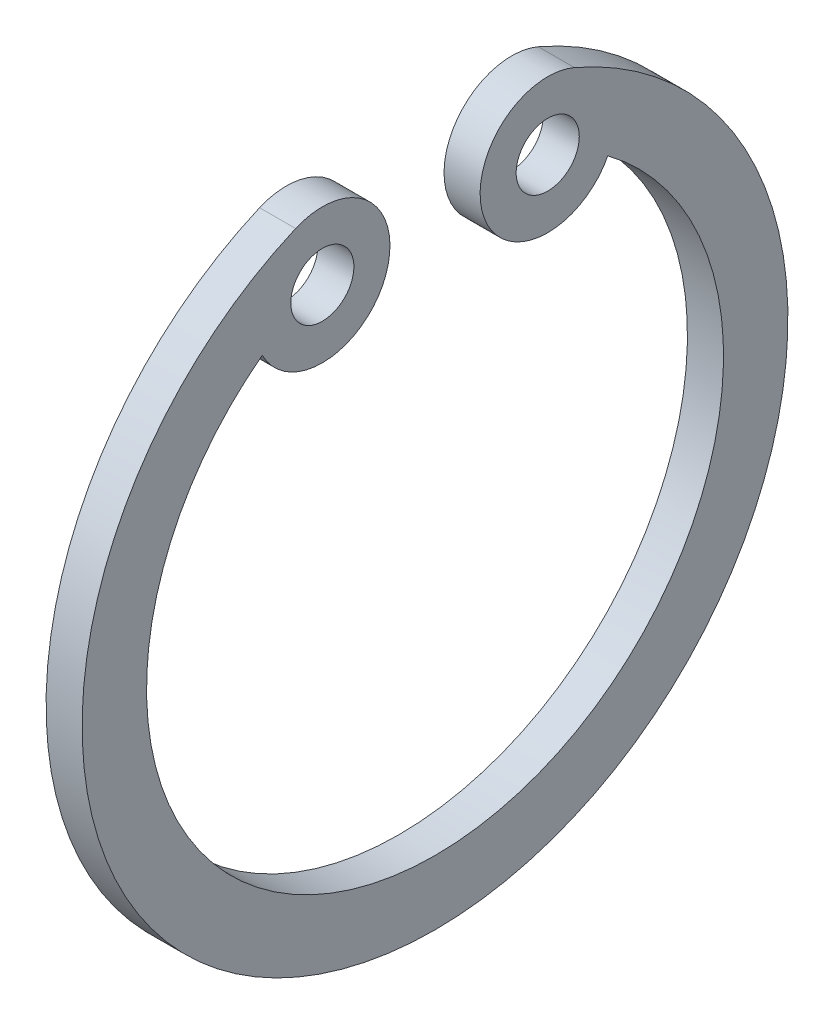
ISO-10303-21;
HEADER;
FILE_DESCRIPTION(('STEP AP214'),'2;1');
FILE_NAME('part.step','',(''),(''),'','','');
FILE_SCHEMA(('AUTOMOTIVE_DESIGN { 1 0 10303 214 1 1 1 1 }'));
ENDSEC;
DATA;
#1=APPLICATION_CONTEXT('core data for automotive mechanical design processes');
#2=APPLICATION_PROTOCOL_DEFINITION('international standard','automotive_design',2000,#1);
#3=PRODUCT_CONTEXT('',#1,'mechanical');
#4=PRODUCT('Part','Part','',(#3));
#5=PRODUCT_RELATED_PRODUCT_CATEGORY('part','',(#4));
#6=PRODUCT_DEFINITION_FORMATION('','',#4);
#7=PRODUCT_DEFINITION_CONTEXT('part definition',#1,'design');
#8=PRODUCT_DEFINITION('design','',#6,#7);
#9=PRODUCT_DEFINITION_SHAPE('','',#8);
#10=(LENGTH_UNIT() NAMED_UNIT(*) SI_UNIT(.MILLI.,.METRE.));
#11=(NAMED_UNIT(*) PLANE_ANGLE_UNIT() SI_UNIT($,.RADIAN.));
#12=(NAMED_UNIT(*) SI_UNIT($,.STERADIAN.) SOLID_ANGLE_UNIT());
#13=UNCERTAINTY_MEASURE_WITH_UNIT(LENGTH_MEASURE(1.E-05),#10,'distance_accuracy_value','');
#14=(GEOMETRIC_REPRESENTATION_CONTEXT(3) GLOBAL_UNCERTAINTY_ASSIGNED_CONTEXT((#13)) GLOBAL_UNIT_ASSIGNED_CONTEXT((#10,
#11,#12)) REPRESENTATION_CONTEXT('',''));
#15=CARTESIAN_POINT('',(0.,0.,0.));
#16=DIRECTION('',(0.,0.,1.));
#17=DIRECTION('',(1.,0.,0.));
#18=AXIS2_PLACEMENT_3D('',#15,#16,#17);
#19=CARTESIAN_POINT('',(0.8,8.32412153506502,1.11447788203431));
#20=DIRECTION('',(-1.,0.,0.));
#21=DIRECTION('',(0.,0.,1.));
#22=AXIS2_PLACEMENT_3D('',#19,#20,#21);
#23=PLANE('',#22);
#24=CARTESIAN_POINT('',(0.8,5.41702024255133,-0.135522117965692));
#25=DIRECTION('',(-1.,0.,0.));
#26=DIRECTION('',(0.,0.,1.));
#27=AXIS2_PLACEMENT_3D('',#24,#25,#26);
#28=CIRCLE('',#27,6.4);
#29=CARTESIAN_POINT('',(0.8,10.5425774047661,-3.96810137701157));
#30=VERTEX_POINT('',#29);
#31=CARTESIAN_POINT('',(0.8,10.5425774047661,3.69705714108019));
#32=VERTEX_POINT('',#31);
#33=EDGE_CURVE('E89',#30,#32,#28,.T.);
#34=ORIENTED_EDGE('',*,*,#33,.T.);
#35=CARTESIAN_POINT('',(0.8,11.2312228275787,2.36447788203431));
#36=DIRECTION('',(1.,0.,0.));
#37=DIRECTION('',(0.,0.,1.));
#38=AXIS2_PLACEMENT_3D('',#35,#36,#37);
#39=CIRCLE('',#38,1.5);
#40=CARTESIAN_POINT('',(0.8,12.609235821468,2.95699808310107));
#41=VERTEX_POINT('',#40);
#42=EDGE_CURVE('E84',#32,#41,#39,.T.);
#43=ORIENTED_EDGE('',*,*,#42,.T.);
#44=CARTESIAN_POINT('',(0.8,5.41702024255133,-0.135522117965692));
#45=DIRECTION('',(1.,0.,0.));
#46=DIRECTION('',(0.,0.,-1.));
#47=AXIS2_PLACEMENT_3D('',#44,#45,#46);
#48=CIRCLE('',#47,7.82889814262634);
#49=CARTESIAN_POINT('',(0.8,12.609235821468,-3.22804231903245));
#50=VERTEX_POINT('',#49);
#51=EDGE_CURVE('E87',#41,#50,#48,.T.);
#52=ORIENTED_EDGE('',*,*,#51,.T.);
#53=CARTESIAN_POINT('',(0.8,11.2312228275787,-2.63552211796569));
#54=DIRECTION('',(1.,0.,0.));
#55=DIRECTION('',(0.,0.,-1.));
#56=AXIS2_PLACEMENT_3D('',#53,#54,#55);
#57=CIRCLE('',#56,1.5);
#58=EDGE_CURVE('E54',#50,#30,#57,.T.);
#59=ORIENTED_EDGE('',*,*,#58,.T.);
#60=EDGE_LOOP('',(#34,#43,#52,#59));
#61=FACE_BOUND('',#60,.T.);
#62=CARTESIAN_POINT('',(0.8,11.2312228275787,-2.63552211796569));
#63=DIRECTION('',(1.,0.,0.));
#64=DIRECTION('',(0.,0.,-1.));
#65=AXIS2_PLACEMENT_3D('',#62,#63,#64);
#66=CIRCLE('',#65,0.7);
#67=CARTESIAN_POINT('',(0.8,11.2312228275787,-3.33552211796569));
#68=VERTEX_POINT('',#67);
#69=EDGE_CURVE('E104',#68,#68,#66,.T.);
#70=ORIENTED_EDGE('',*,*,#69,.F.);
#71=EDGE_LOOP('',(#70));
#72=FACE_BOUND('',#71,.T.);
#73=CARTESIAN_POINT('',(0.8,11.2312228275787,2.36447788203431));
#74=DIRECTION('',(1.,0.,0.));
#75=DIRECTION('',(0.,0.,1.));
#76=AXIS2_PLACEMENT_3D('',#73,#74,#75);
#77=CIRCLE('',#76,0.7);
#78=CARTESIAN_POINT('',(0.8,11.2312228275787,3.06447788203431));
#79=VERTEX_POINT('',#78);
#80=EDGE_CURVE('E119',#79,#79,#77,.T.);
#81=ORIENTED_EDGE('',*,*,#80,.F.);
#82=EDGE_LOOP('',(#81));
#83=FACE_BOUND('',#82,.T.);
#84=ADVANCED_FACE('F37',(#61,#72,#83),#23,.F.);
#85=CARTESIAN_POINT('',(0.,8.32412153506502,1.11447788203431));
#86=DIRECTION('',(-1.,0.,0.));
#87=DIRECTION('',(0.,0.,1.));
#88=AXIS2_PLACEMENT_3D('',#85,#86,#87);
#89=PLANE('',#88);
#90=CARTESIAN_POINT('',(0.,11.2312228275787,-2.63552211796569));
#91=DIRECTION('',(1.,0.,0.));
#92=DIRECTION('',(0.,0.,-1.));
#93=AXIS2_PLACEMENT_3D('',#90,#91,#92);
#94=CIRCLE('',#93,0.7);
#95=CARTESIAN_POINT('',(0.,11.2312228275787,-3.33552211796569));
#96=VERTEX_POINT('',#95);
#97=EDGE_CURVE('E116',#96,#96,#94,.T.);
#98=ORIENTED_EDGE('',*,*,#97,.T.);
#99=EDGE_LOOP('',(#98));
#100=FACE_BOUND('',#99,.T.);
#101=CARTESIAN_POINT('',(0.,5.41702024255133,-0.135522117965692));
#102=DIRECTION('',(-1.,0.,0.));
#103=DIRECTION('',(0.,0.,1.));
#104=AXIS2_PLACEMENT_3D('',#101,#102,#103);
#105=CIRCLE('',#104,6.4);
#106=CARTESIAN_POINT('',(0.,10.5425774047661,-3.96810137701157));
#107=VERTEX_POINT('',#106);
#108=CARTESIAN_POINT('',(0.,10.5425774047661,3.69705714108019));
#109=VERTEX_POINT('',#108);
#110=EDGE_CURVE('E101',#107,#109,#105,.T.);
#111=ORIENTED_EDGE('',*,*,#110,.F.);
#112=CARTESIAN_POINT('',(0.,11.2312228275787,-2.63552211796569));
#113=DIRECTION('',(1.,0.,0.));
#114=DIRECTION('',(0.,0.,-1.));
#115=AXIS2_PLACEMENT_3D('',#112,#113,#114);
#116=CIRCLE('',#115,1.5);
#117=CARTESIAN_POINT('',(0.,12.609235821468,-3.22804231903245));
#118=VERTEX_POINT('',#117);
#119=EDGE_CURVE('E77',#118,#107,#116,.T.);
#120=ORIENTED_EDGE('',*,*,#119,.F.);
#121=CARTESIAN_POINT('',(0.,5.41702024255133,-0.135522117965692));
#122=DIRECTION('',(1.,0.,0.));
#123=DIRECTION('',(0.,0.,-1.));
#124=AXIS2_PLACEMENT_3D('',#121,#122,#123);
#125=CIRCLE('',#124,7.82889814262634);
#126=CARTESIAN_POINT('',(0.,12.609235821468,2.95699808310107));
#127=VERTEX_POINT('',#126);
#128=EDGE_CURVE('E71',#127,#118,#125,.T.);
#129=ORIENTED_EDGE('',*,*,#128,.F.);
#130=CARTESIAN_POINT('',(0.,11.2312228275787,2.36447788203431));
#131=DIRECTION('',(1.,0.,0.));
#132=DIRECTION('',(0.,0.,1.));
#133=AXIS2_PLACEMENT_3D('',#130,#131,#132);
#134=CIRCLE('',#133,1.5);
#135=EDGE_CURVE('E93',#109,#127,#134,.T.);
#136=ORIENTED_EDGE('',*,*,#135,.F.);
#137=EDGE_LOOP('',(#111,#120,#129,#136));
#138=FACE_BOUND('',#137,.T.);
#139=CARTESIAN_POINT('',(0.,11.2312228275787,2.36447788203431));
#140=DIRECTION('',(1.,0.,0.));
#141=DIRECTION('',(0.,0.,1.));
#142=AXIS2_PLACEMENT_3D('',#139,#140,#141);
#143=CIRCLE('',#142,0.7);
#144=CARTESIAN_POINT('',(0.,11.2312228275787,3.06447788203431));
#145=VERTEX_POINT('',#144);
#146=EDGE_CURVE('E122',#145,#145,#143,.T.);
#147=ORIENTED_EDGE('',*,*,#146,.T.);
#148=EDGE_LOOP('',(#147));
#149=FACE_BOUND('',#148,.T.);
#150=ADVANCED_FACE('F112',(#100,#138,#149),#89,.T.);
#151=CARTESIAN_POINT('',(0.8,5.41702024255133,-0.135522117965692));
#152=DIRECTION('',(-1.,0.,0.));
#153=DIRECTION('',(0.,0.,1.));
#154=AXIS2_PLACEMENT_3D('',#151,#152,#153);
#155=CYLINDRICAL_SURFACE('',#154,6.4);
#156=ORIENTED_EDGE('',*,*,#110,.T.);
#157=DIRECTION('',(-1.,0.,0.));
#158=VECTOR('',#157,1.);
#159=CARTESIAN_POINT('',(0.8,10.5425774047661,3.69705714108019));
#160=LINE('',#159,#158);
#161=EDGE_CURVE('E11',#32,#109,#160,.T.);
#162=ORIENTED_EDGE('',*,*,#161,.F.);
#163=ORIENTED_EDGE('',*,*,#33,.F.);
#164=DIRECTION('',(-1.,0.,0.));
#165=VECTOR('',#164,1.);
#166=CARTESIAN_POINT('',(0.8,10.5425774047661,-3.96810137701157));
#167=LINE('',#166,#165);
#168=EDGE_CURVE('E97',#30,#107,#167,.T.);
#169=ORIENTED_EDGE('',*,*,#168,.T.);
#170=EDGE_LOOP('',(#156,#162,#163,#169));
#171=FACE_BOUND('',#170,.T.);
#172=ADVANCED_FACE('F39',(#171),#155,.F.);
#173=CARTESIAN_POINT('',(0.8,11.2312228275787,2.36447788203431));
#174=DIRECTION('',(-1.,0.,0.));
#175=DIRECTION('',(0.,0.,1.));
#176=AXIS2_PLACEMENT_3D('',#173,#174,#175);
#177=CYLINDRICAL_SURFACE('',#176,1.5);
#178=ORIENTED_EDGE('',*,*,#135,.T.);
#179=DIRECTION('',(-1.,0.,0.));
#180=VECTOR('',#179,1.);
#181=CARTESIAN_POINT('',(0.8,12.609235821468,2.95699808310107));
#182=LINE('',#181,#180);
#183=EDGE_CURVE('E46',#41,#127,#182,.T.);
#184=ORIENTED_EDGE('',*,*,#183,.F.);
#185=ORIENTED_EDGE('',*,*,#42,.F.);
#186=ORIENTED_EDGE('',*,*,#161,.T.);
#187=EDGE_LOOP('',(#178,#184,#185,#186));
#188=FACE_BOUND('',#187,.T.);
#189=ADVANCED_FACE('F92',(#188),#177,.T.);
#190=CARTESIAN_POINT('',(0.8,5.41702024255133,-0.135522117965692));
#191=DIRECTION('',(-1.,0.,0.));
#192=DIRECTION('',(0.,0.,1.));
#193=AXIS2_PLACEMENT_3D('',#190,#191,#192);
#194=CYLINDRICAL_SURFACE('',#193,7.82889814262634);
#195=ORIENTED_EDGE('',*,*,#128,.T.);
#196=DIRECTION('',(-1.,0.,0.));
#197=VECTOR('',#196,1.);
#198=CARTESIAN_POINT('',(0.8,12.609235821468,-3.22804231903245));
#199=LINE('',#198,#197);
#200=EDGE_CURVE('E94',#50,#118,#199,.T.);
#201=ORIENTED_EDGE('',*,*,#200,.F.);
#202=ORIENTED_EDGE('',*,*,#51,.F.);
#203=ORIENTED_EDGE('',*,*,#183,.T.);
#204=EDGE_LOOP('',(#195,#201,#202,#203));
#205=FACE_BOUND('',#204,.T.);
#206=ADVANCED_FACE('F95',(#205),#194,.T.);
#207=CARTESIAN_POINT('',(0.8,11.2312228275787,-2.63552211796569));
#208=DIRECTION('',(-1.,0.,0.));
#209=DIRECTION('',(0.,0.,1.));
#210=AXIS2_PLACEMENT_3D('',#207,#208,#209);
#211=CYLINDRICAL_SURFACE('',#210,1.5);
#212=ORIENTED_EDGE('',*,*,#119,.T.);
#213=ORIENTED_EDGE('',*,*,#168,.F.);
#214=ORIENTED_EDGE('',*,*,#58,.F.);
#215=ORIENTED_EDGE('',*,*,#200,.T.);
#216=EDGE_LOOP('',(#212,#213,#214,#215));
#217=FACE_BOUND('',#216,.T.);
#218=ADVANCED_FACE('F109',(#217),#211,.T.);
#219=CARTESIAN_POINT('',(0.8,11.2312228275787,-2.63552211796569));
#220=DIRECTION('',(-1.,0.,0.));
#221=DIRECTION('',(0.,0.,1.));
#222=AXIS2_PLACEMENT_3D('',#219,#220,#221);
#223=CYLINDRICAL_SURFACE('',#222,0.7);
#224=ORIENTED_EDGE('',*,*,#69,.T.);
#225=EDGE_LOOP('',(#224));
#226=FACE_BOUND('',#225,.T.);
#227=ORIENTED_EDGE('',*,*,#97,.F.);
#228=EDGE_LOOP('',(#227));
#229=FACE_BOUND('',#228,.T.);
#230=ADVANCED_FACE('F139',(#226,#229),#223,.F.);
#231=CARTESIAN_POINT('',(0.8,11.2312228275787,2.36447788203431));
#232=DIRECTION('',(-1.,0.,0.));
#233=DIRECTION('',(0.,0.,1.));
#234=AXIS2_PLACEMENT_3D('',#231,#232,#233);
#235=CYLINDRICAL_SURFACE('',#234,0.7);
#236=ORIENTED_EDGE('',*,*,#80,.T.);
#237=EDGE_LOOP('',(#236));
#238=FACE_BOUND('',#237,.T.);
#239=ORIENTED_EDGE('',*,*,#146,.F.);
#240=EDGE_LOOP('',(#239));
#241=FACE_BOUND('',#240,.T.);
#242=ADVANCED_FACE('F128',(#238,#241),#235,.F.);
#243=CLOSED_SHELL('',(#84,#150,#172,#189,#206,#218,#230,#242));
#244=MANIFOLD_SOLID_BREP('B2',#243);
#245=ADVANCED_BREP_SHAPE_REPRESENTATION('',(#18,#244),#14);
#246=SHAPE_DEFINITION_REPRESENTATION(#9,#245);
ENDSEC;
END-ISO-10303-21;
